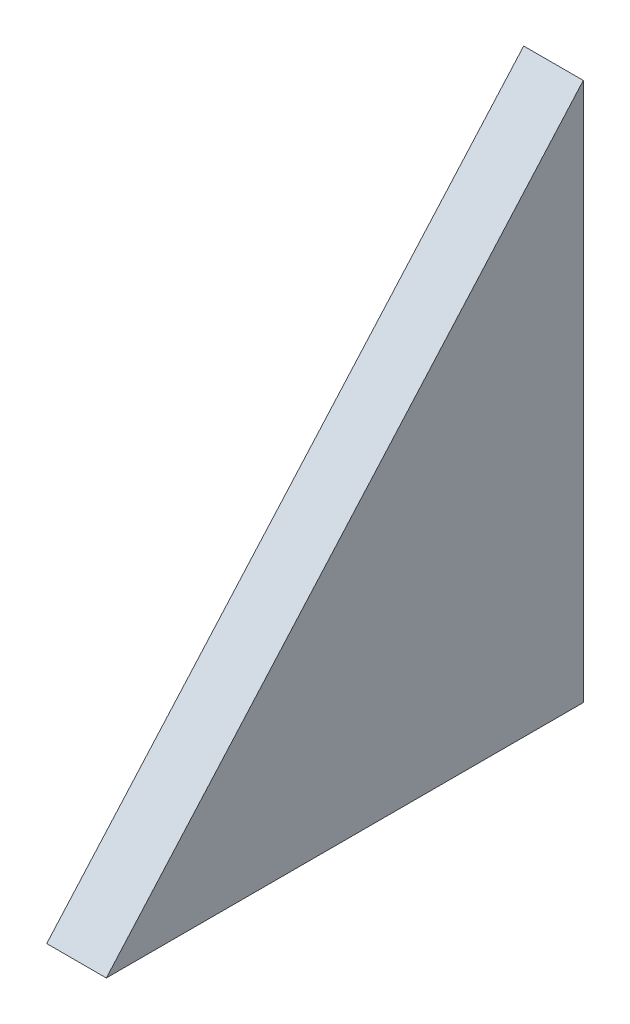
ISO-10303-21;
HEADER;
FILE_DESCRIPTION(('STEP AP214'),'2;1');
FILE_NAME('part.step','',(''),(''),'','','');
FILE_SCHEMA(('AUTOMOTIVE_DESIGN { 1 0 10303 214 1 1 1 1 }'));
ENDSEC;
DATA;
#1=APPLICATION_CONTEXT('core data for automotive mechanical design processes');
#2=APPLICATION_PROTOCOL_DEFINITION('international standard','automotive_design',2000,#1);
#3=PRODUCT_CONTEXT('',#1,'mechanical');
#4=PRODUCT('Part','Part','',(#3));
#5=PRODUCT_RELATED_PRODUCT_CATEGORY('part','',(#4));
#6=PRODUCT_DEFINITION_FORMATION('','',#4);
#7=PRODUCT_DEFINITION_CONTEXT('part definition',#1,'design');
#8=PRODUCT_DEFINITION('design','',#6,#7);
#9=PRODUCT_DEFINITION_SHAPE('','',#8);
#10=(LENGTH_UNIT() NAMED_UNIT(*) SI_UNIT(.MILLI.,.METRE.));
#11=(NAMED_UNIT(*) PLANE_ANGLE_UNIT() SI_UNIT($,.RADIAN.));
#12=(NAMED_UNIT(*) SI_UNIT($,.STERADIAN.) SOLID_ANGLE_UNIT());
#13=UNCERTAINTY_MEASURE_WITH_UNIT(LENGTH_MEASURE(1.E-05),#10,'distance_accuracy_value','');
#14=(GEOMETRIC_REPRESENTATION_CONTEXT(3) GLOBAL_UNCERTAINTY_ASSIGNED_CONTEXT((#13)) GLOBAL_UNIT_ASSIGNED_CONTEXT((#10,
#11,#12)) REPRESENTATION_CONTEXT('',''));
#15=CARTESIAN_POINT('',(0.,0.,0.));
#16=DIRECTION('',(0.,0.,1.));
#17=DIRECTION('',(1.,0.,0.));
#18=AXIS2_PLACEMENT_3D('',#15,#16,#17);
#19=CARTESIAN_POINT('',(8.,-36.2340236820187,32.0743778098091));
#20=DIRECTION('',(0.,-0.662819653603404,-0.748779077430095));
#21=DIRECTION('',(0.,0.748779077430095,-0.662819653603404));
#22=AXIS2_PLACEMENT_3D('',#19,#20,#21);
#23=PLANE('',#22);
#24=DIRECTION('',(0.,-0.748779077430095,0.662819653603403));
#25=VECTOR('',#24,1.);
#26=CARTESIAN_POINT('',(0.,-36.2340236820187,32.0743778098091));
#27=LINE('',#26,#25);
#28=CARTESIAN_POINT('',(0.,36.0659763179813,-31.9256221901909));
#29=VERTEX_POINT('',#28);
#30=CARTESIAN_POINT('',(0.,-36.2340236820187,32.0743778098091));
#31=VERTEX_POINT('',#30);
#32=EDGE_CURVE('E89',#29,#31,#27,.T.);
#33=ORIENTED_EDGE('',*,*,#32,.T.);
#34=DIRECTION('',(-1.,0.,0.));
#35=VECTOR('',#34,1.);
#36=CARTESIAN_POINT('',(8.,-36.2340236820187,32.0743778098091));
#37=LINE('',#36,#35);
#38=CARTESIAN_POINT('',(8.,-36.2340236820187,32.0743778098091));
#39=VERTEX_POINT('',#38);
#40=EDGE_CURVE('E11',#39,#31,#37,.T.);
#41=ORIENTED_EDGE('',*,*,#40,.F.);
#42=DIRECTION('',(0.,-0.748779077430095,0.662819653603403));
#43=VECTOR('',#42,1.);
#44=CARTESIAN_POINT('',(8.,-36.2340236820187,32.0743778098091));
#45=LINE('',#44,#43);
#46=CARTESIAN_POINT('',(8.,36.0659763179813,-31.9256221901909));
#47=VERTEX_POINT('',#46);
#48=EDGE_CURVE('E81',#47,#39,#45,.T.);
#49=ORIENTED_EDGE('',*,*,#48,.F.);
#50=DIRECTION('',(-1.,0.,0.));
#51=VECTOR('',#50,1.);
#52=CARTESIAN_POINT('',(8.,36.0659763179813,-31.9256221901909));
#53=LINE('',#52,#51);
#54=EDGE_CURVE('E90',#47,#29,#53,.T.);
#55=ORIENTED_EDGE('',*,*,#54,.T.);
#56=EDGE_LOOP('',(#33,#41,#49,#55));
#57=FACE_BOUND('',#56,.T.);
#58=ADVANCED_FACE('F39',(#57),#23,.F.);
#59=CARTESIAN_POINT('',(8.,-36.2340236820187,32.0743778098091));
#60=DIRECTION('',(0.,1.,0.));
#61=DIRECTION('',(0.,0.,1.));
#62=AXIS2_PLACEMENT_3D('',#59,#60,#61);
#63=PLANE('',#62);
#64=DIRECTION('',(0.,0.,-1.));
#65=VECTOR('',#64,1.);
#66=CARTESIAN_POINT('',(0.,-36.2340236820187,32.0743778098091));
#67=LINE('',#66,#65);
#68=CARTESIAN_POINT('',(0.,-36.2340236820187,-31.9256221901909));
#69=VERTEX_POINT('',#68);
#70=EDGE_CURVE('E68',#31,#69,#67,.T.);
#71=ORIENTED_EDGE('',*,*,#70,.T.);
#72=DIRECTION('',(-1.,0.,0.));
#73=VECTOR('',#72,1.);
#74=CARTESIAN_POINT('',(8.,-36.2340236820187,-31.9256221901909));
#75=LINE('',#74,#73);
#76=CARTESIAN_POINT('',(8.,-36.2340236820187,-31.9256221901909));
#77=VERTEX_POINT('',#76);
#78=EDGE_CURVE('E48',#77,#69,#75,.T.);
#79=ORIENTED_EDGE('',*,*,#78,.F.);
#80=DIRECTION('',(0.,0.,-1.));
#81=VECTOR('',#80,1.);
#82=CARTESIAN_POINT('',(8.,-36.2340236820187,32.0743778098091));
#83=LINE('',#82,#81);
#84=EDGE_CURVE('E76',#39,#77,#83,.T.);
#85=ORIENTED_EDGE('',*,*,#84,.F.);
#86=ORIENTED_EDGE('',*,*,#40,.T.);
#87=EDGE_LOOP('',(#71,#79,#85,#86));
#88=FACE_BOUND('',#87,.T.);
#89=ADVANCED_FACE('F77',(#88),#63,.F.);
#90=CARTESIAN_POINT('',(8.,-36.2340236820187,-31.9256221901909));
#91=DIRECTION('',(0.,0.,1.));
#92=DIRECTION('',(1.,0.,0.));
#93=AXIS2_PLACEMENT_3D('',#90,#91,#92);
#94=PLANE('',#93);
#95=DIRECTION('',(0.,1.,0.));
#96=VECTOR('',#95,1.);
#97=CARTESIAN_POINT('',(0.,-36.2340236820187,-31.9256221901909));
#98=LINE('',#97,#96);
#99=EDGE_CURVE('E73',#69,#29,#98,.T.);
#100=ORIENTED_EDGE('',*,*,#99,.T.);
#101=ORIENTED_EDGE('',*,*,#54,.F.);
#102=DIRECTION('',(0.,1.,0.));
#103=VECTOR('',#102,1.);
#104=CARTESIAN_POINT('',(8.,-36.2340236820187,-31.9256221901909));
#105=LINE('',#104,#103);
#106=EDGE_CURVE('E56',#77,#47,#105,.T.);
#107=ORIENTED_EDGE('',*,*,#106,.F.);
#108=ORIENTED_EDGE('',*,*,#78,.T.);
#109=EDGE_LOOP('',(#100,#101,#107,#108));
#110=FACE_BOUND('',#109,.T.);
#111=ADVANCED_FACE('F102',(#110),#94,.F.);
#112=CARTESIAN_POINT('',(8.,0.,0.));
#113=DIRECTION('',(-1.,0.,0.));
#114=DIRECTION('',(0.,0.,1.));
#115=AXIS2_PLACEMENT_3D('',#112,#113,#114);
#116=PLANE('',#115);
#117=ORIENTED_EDGE('',*,*,#48,.T.);
#118=ORIENTED_EDGE('',*,*,#84,.T.);
#119=ORIENTED_EDGE('',*,*,#106,.T.);
#120=EDGE_LOOP('',(#117,#118,#119));
#121=FACE_BOUND('',#120,.T.);
#122=ADVANCED_FACE('F84',(#121),#116,.F.);
#123=CARTESIAN_POINT('',(0.,0.,0.));
#124=DIRECTION('',(-1.,0.,0.));
#125=DIRECTION('',(0.,0.,1.));
#126=AXIS2_PLACEMENT_3D('',#123,#124,#125);
#127=PLANE('',#126);
#128=ORIENTED_EDGE('',*,*,#32,.F.);
#129=ORIENTED_EDGE('',*,*,#99,.F.);
#130=ORIENTED_EDGE('',*,*,#70,.F.);
#131=EDGE_LOOP('',(#128,#129,#130));
#132=FACE_BOUND('',#131,.T.);
#133=ADVANCED_FACE('F103',(#132),#127,.T.);
#134=CLOSED_SHELL('',(#58,#89,#111,#122,#133));
#135=MANIFOLD_SOLID_BREP('B2',#134);
#136=ADVANCED_BREP_SHAPE_REPRESENTATION('',(#18,#135),#14);
#137=SHAPE_DEFINITION_REPRESENTATION(#9,#136);
ENDSEC;
END-ISO-10303-21;
